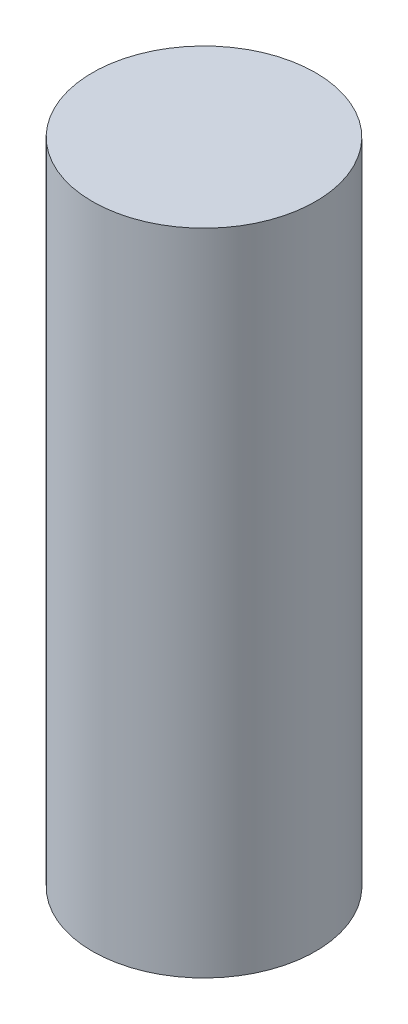
ISO-10303-21;
HEADER;
FILE_DESCRIPTION(('STEP AP214'),'2;1');
FILE_NAME('part.step','',(''),(''),'','','');
FILE_SCHEMA(('AUTOMOTIVE_DESIGN { 1 0 10303 214 1 1 1 1 }'));
ENDSEC;
DATA;
#1=APPLICATION_CONTEXT('core data for automotive mechanical design processes');
#2=APPLICATION_PROTOCOL_DEFINITION('international standard','automotive_design',2000,#1);
#3=PRODUCT_CONTEXT('',#1,'mechanical');
#4=PRODUCT('Part','Part','',(#3));
#5=PRODUCT_RELATED_PRODUCT_CATEGORY('part','',(#4));
#6=PRODUCT_DEFINITION_FORMATION('','',#4);
#7=PRODUCT_DEFINITION_CONTEXT('part definition',#1,'design');
#8=PRODUCT_DEFINITION('design','',#6,#7);
#9=PRODUCT_DEFINITION_SHAPE('','',#8);
#10=(LENGTH_UNIT() NAMED_UNIT(*) SI_UNIT(.MILLI.,.METRE.));
#11=(NAMED_UNIT(*) PLANE_ANGLE_UNIT() SI_UNIT($,.RADIAN.));
#12=(NAMED_UNIT(*) SI_UNIT($,.STERADIAN.) SOLID_ANGLE_UNIT());
#13=UNCERTAINTY_MEASURE_WITH_UNIT(LENGTH_MEASURE(1.E-05),#10,'distance_accuracy_value','');
#14=(GEOMETRIC_REPRESENTATION_CONTEXT(3) GLOBAL_UNCERTAINTY_ASSIGNED_CONTEXT((#13)) GLOBAL_UNIT_ASSIGNED_CONTEXT((#10,
#11,#12)) REPRESENTATION_CONTEXT('',''));
#15=CARTESIAN_POINT('',(0.,0.,0.));
#16=DIRECTION('',(0.,0.,1.));
#17=DIRECTION('',(1.,0.,0.));
#18=AXIS2_PLACEMENT_3D('',#15,#16,#17);
#19=CARTESIAN_POINT('',(0.,160.,0.));
#20=DIRECTION('',(0.,-1.,0.));
#21=DIRECTION('',(0.,0.,-1.));
#22=AXIS2_PLACEMENT_3D('',#19,#20,#21);
#23=CYLINDRICAL_SURFACE('',#22,27.5);
#24=CARTESIAN_POINT('',(0.,160.,0.));
#25=DIRECTION('',(0.,1.,0.));
#26=DIRECTION('',(0.,0.,1.));
#27=AXIS2_PLACEMENT_3D('',#24,#25,#26);
#28=CIRCLE('',#27,27.5);
#29=CARTESIAN_POINT('',(0.,160.,27.5));
#30=VERTEX_POINT('',#29);
#31=EDGE_CURVE('E10',#30,#30,#28,.T.);
#32=ORIENTED_EDGE('',*,*,#31,.F.);
#33=EDGE_LOOP('',(#32));
#34=FACE_BOUND('',#33,.T.);
#35=CARTESIAN_POINT('',(0.,0.,0.));
#36=DIRECTION('',(0.,1.,0.));
#37=DIRECTION('',(0.,0.,1.));
#38=AXIS2_PLACEMENT_3D('',#35,#36,#37);
#39=CIRCLE('',#38,27.5);
#40=CARTESIAN_POINT('',(0.,0.,27.5));
#41=VERTEX_POINT('',#40);
#42=EDGE_CURVE('E38',#41,#41,#39,.T.);
#43=ORIENTED_EDGE('',*,*,#42,.T.);
#44=EDGE_LOOP('',(#43));
#45=FACE_BOUND('',#44,.T.);
#46=ADVANCED_FACE('F35',(#34,#45),#23,.T.);
#47=CARTESIAN_POINT('',(0.,160.,0.));
#48=DIRECTION('',(0.,1.,0.));
#49=DIRECTION('',(0.,0.,1.));
#50=AXIS2_PLACEMENT_3D('',#47,#48,#49);
#51=PLANE('',#50);
#52=ORIENTED_EDGE('',*,*,#31,.T.);
#53=EDGE_LOOP('',(#52));
#54=FACE_BOUND('',#53,.T.);
#55=ADVANCED_FACE('F50',(#54),#51,.T.);
#56=CARTESIAN_POINT('',(0.,0.,0.));
#57=DIRECTION('',(0.,1.,0.));
#58=DIRECTION('',(0.,0.,1.));
#59=AXIS2_PLACEMENT_3D('',#56,#57,#58);
#60=PLANE('',#59);
#61=ORIENTED_EDGE('',*,*,#42,.F.);
#62=EDGE_LOOP('',(#61));
#63=FACE_BOUND('',#62,.T.);
#64=ADVANCED_FACE('F48',(#63),#60,.F.);
#65=CLOSED_SHELL('',(#46,#55,#64));
#66=MANIFOLD_SOLID_BREP('B2',#65);
#67=ADVANCED_BREP_SHAPE_REPRESENTATION('',(#18,#66),#14);
#68=SHAPE_DEFINITION_REPRESENTATION(#9,#67);
ENDSEC;
END-ISO-10303-21;
